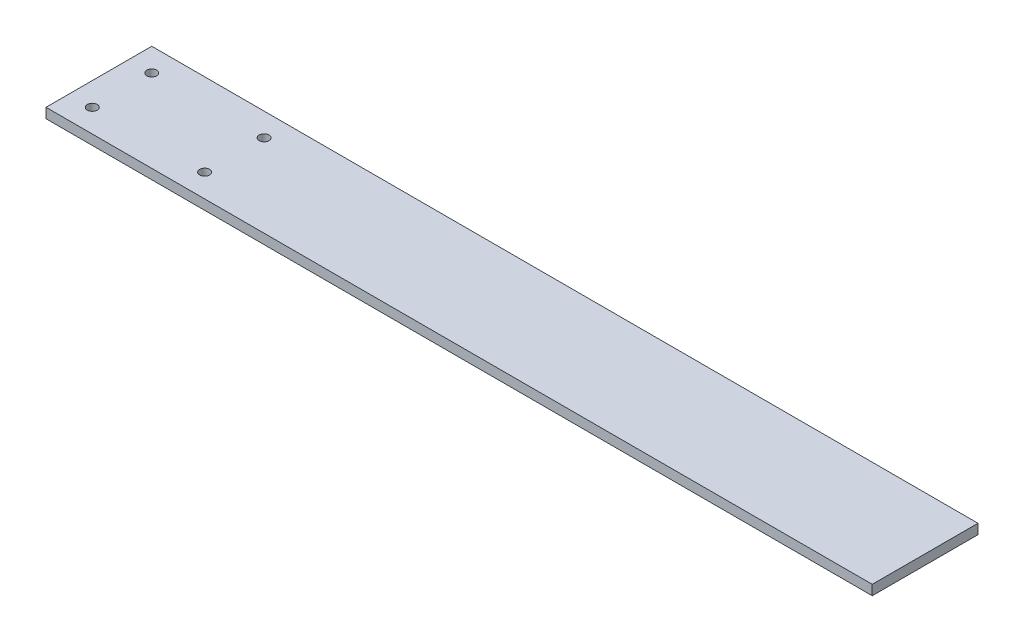
ISO-10303-21;
HEADER;
FILE_DESCRIPTION(('STEP AP214'),'2;1');
FILE_NAME('part.step','',(''),(''),'','','');
FILE_SCHEMA(('AUTOMOTIVE_DESIGN { 1 0 10303 214 1 1 1 1 }'));
ENDSEC;
DATA;
#1=APPLICATION_CONTEXT('core data for automotive mechanical design processes');
#2=APPLICATION_PROTOCOL_DEFINITION('international standard','automotive_design',2000,#1);
#3=PRODUCT_CONTEXT('',#1,'mechanical');
#4=PRODUCT('Part','Part','',(#3));
#5=PRODUCT_RELATED_PRODUCT_CATEGORY('part','',(#4));
#6=PRODUCT_DEFINITION_FORMATION('','',#4);
#7=PRODUCT_DEFINITION_CONTEXT('part definition',#1,'design');
#8=PRODUCT_DEFINITION('design','',#6,#7);
#9=PRODUCT_DEFINITION_SHAPE('','',#8);
#10=(LENGTH_UNIT() NAMED_UNIT(*) SI_UNIT(.MILLI.,.METRE.));
#11=(NAMED_UNIT(*) PLANE_ANGLE_UNIT() SI_UNIT($,.RADIAN.));
#12=(NAMED_UNIT(*) SI_UNIT($,.STERADIAN.) SOLID_ANGLE_UNIT());
#13=UNCERTAINTY_MEASURE_WITH_UNIT(LENGTH_MEASURE(1.E-05),#10,'distance_accuracy_value','');
#14=(GEOMETRIC_REPRESENTATION_CONTEXT(3) GLOBAL_UNCERTAINTY_ASSIGNED_CONTEXT((#13)) GLOBAL_UNIT_ASSIGNED_CONTEXT((#10,
#11,#12)) REPRESENTATION_CONTEXT('',''));
#15=CARTESIAN_POINT('',(0.,0.,0.));
#16=DIRECTION('',(0.,0.,1.));
#17=DIRECTION('',(1.,0.,0.));
#18=AXIS2_PLACEMENT_3D('',#15,#16,#17);
#19=CARTESIAN_POINT('',(0.,3.,0.));
#20=DIRECTION('',(0.,1.,0.));
#21=DIRECTION('',(0.,0.,1.));
#22=AXIS2_PLACEMENT_3D('',#19,#20,#21);
#23=PLANE('',#22);
#24=CARTESIAN_POINT('',(-84.,3.,9.));
#25=DIRECTION('',(0.,1.,0.));
#26=DIRECTION('',(0.,0.,1.));
#27=AXIS2_PLACEMENT_3D('',#24,#25,#26);
#28=CIRCLE('',#27,1.5);
#29=CARTESIAN_POINT('',(-84.,3.,10.5));
#30=VERTEX_POINT('',#29);
#31=EDGE_CURVE('E121',#30,#30,#28,.T.);
#32=ORIENTED_EDGE('',*,*,#31,.F.);
#33=EDGE_LOOP('',(#32));
#34=FACE_BOUND('',#33,.T.);
#35=CARTESIAN_POINT('',(-118.,3.,-9.));
#36=DIRECTION('',(0.,1.,0.));
#37=DIRECTION('',(0.,0.,1.));
#38=AXIS2_PLACEMENT_3D('',#35,#36,#37);
#39=CIRCLE('',#38,1.5);
#40=CARTESIAN_POINT('',(-118.,3.,-7.5));
#41=VERTEX_POINT('',#40);
#42=EDGE_CURVE('E100',#41,#41,#39,.T.);
#43=ORIENTED_EDGE('',*,*,#42,.F.);
#44=EDGE_LOOP('',(#43));
#45=FACE_BOUND('',#44,.T.);
#46=DIRECTION('',(0.,0.,-1.));
#47=VECTOR('',#46,1.);
#48=CARTESIAN_POINT('',(125.,3.,-16.));
#49=LINE('',#48,#47);
#50=CARTESIAN_POINT('',(125.,3.,16.));
#51=VERTEX_POINT('',#50);
#52=CARTESIAN_POINT('',(125.,3.,-16.));
#53=VERTEX_POINT('',#52);
#54=EDGE_CURVE('E85',#51,#53,#49,.T.);
#55=ORIENTED_EDGE('',*,*,#54,.T.);
#56=DIRECTION('',(-1.,0.,0.));
#57=VECTOR('',#56,1.);
#58=CARTESIAN_POINT('',(-125.,3.,-16.));
#59=LINE('',#58,#57);
#60=CARTESIAN_POINT('',(-125.,3.,-16.));
#61=VERTEX_POINT('',#60);
#62=EDGE_CURVE('E80',#53,#61,#59,.T.);
#63=ORIENTED_EDGE('',*,*,#62,.T.);
#64=DIRECTION('',(0.,0.,1.));
#65=VECTOR('',#64,1.);
#66=CARTESIAN_POINT('',(-125.,3.,-16.));
#67=LINE('',#66,#65);
#68=CARTESIAN_POINT('',(-125.,3.,16.));
#69=VERTEX_POINT('',#68);
#70=EDGE_CURVE('E83',#61,#69,#67,.T.);
#71=ORIENTED_EDGE('',*,*,#70,.T.);
#72=DIRECTION('',(1.,0.,0.));
#73=VECTOR('',#72,1.);
#74=CARTESIAN_POINT('',(-125.,3.,16.));
#75=LINE('',#74,#73);
#76=EDGE_CURVE('E50',#69,#51,#75,.T.);
#77=ORIENTED_EDGE('',*,*,#76,.T.);
#78=EDGE_LOOP('',(#55,#63,#71,#77));
#79=FACE_BOUND('',#78,.T.);
#80=CARTESIAN_POINT('',(-118.,3.,9.));
#81=DIRECTION('',(0.,1.,0.));
#82=DIRECTION('',(0.,0.,1.));
#83=AXIS2_PLACEMENT_3D('',#80,#81,#82);
#84=CIRCLE('',#83,1.5);
#85=CARTESIAN_POINT('',(-118.,3.,10.5));
#86=VERTEX_POINT('',#85);
#87=EDGE_CURVE('E115',#86,#86,#84,.T.);
#88=ORIENTED_EDGE('',*,*,#87,.F.);
#89=EDGE_LOOP('',(#88));
#90=FACE_BOUND('',#89,.T.);
#91=CARTESIAN_POINT('',(-84.,3.,-9.));
#92=DIRECTION('',(0.,1.,0.));
#93=DIRECTION('',(0.,0.,1.));
#94=AXIS2_PLACEMENT_3D('',#91,#92,#93);
#95=CIRCLE('',#94,1.5);
#96=CARTESIAN_POINT('',(-84.,3.,-7.5));
#97=VERTEX_POINT('',#96);
#98=EDGE_CURVE('E127',#97,#97,#95,.T.);
#99=ORIENTED_EDGE('',*,*,#98,.F.);
#100=EDGE_LOOP('',(#99));
#101=FACE_BOUND('',#100,.T.);
#102=ADVANCED_FACE('F33',(#34,#45,#79,#90,#101),#23,.T.);
#103=CARTESIAN_POINT('',(0.,0.,0.));
#104=DIRECTION('',(0.,1.,0.));
#105=DIRECTION('',(0.,0.,1.));
#106=AXIS2_PLACEMENT_3D('',#103,#104,#105);
#107=PLANE('',#106);
#108=DIRECTION('',(0.,0.,-1.));
#109=VECTOR('',#108,1.);
#110=CARTESIAN_POINT('',(125.,0.,-16.));
#111=LINE('',#110,#109);
#112=CARTESIAN_POINT('',(125.,0.,16.));
#113=VERTEX_POINT('',#112);
#114=CARTESIAN_POINT('',(125.,0.,-16.));
#115=VERTEX_POINT('',#114);
#116=EDGE_CURVE('E97',#113,#115,#111,.T.);
#117=ORIENTED_EDGE('',*,*,#116,.F.);
#118=DIRECTION('',(1.,0.,0.));
#119=VECTOR('',#118,1.);
#120=CARTESIAN_POINT('',(-125.,0.,16.));
#121=LINE('',#120,#119);
#122=CARTESIAN_POINT('',(-125.,0.,16.));
#123=VERTEX_POINT('',#122);
#124=EDGE_CURVE('E73',#123,#113,#121,.T.);
#125=ORIENTED_EDGE('',*,*,#124,.F.);
#126=DIRECTION('',(0.,0.,1.));
#127=VECTOR('',#126,1.);
#128=CARTESIAN_POINT('',(-125.,0.,-16.));
#129=LINE('',#128,#127);
#130=CARTESIAN_POINT('',(-125.,0.,-16.));
#131=VERTEX_POINT('',#130);
#132=EDGE_CURVE('E67',#131,#123,#129,.T.);
#133=ORIENTED_EDGE('',*,*,#132,.F.);
#134=DIRECTION('',(-1.,0.,0.));
#135=VECTOR('',#134,1.);
#136=CARTESIAN_POINT('',(-125.,0.,-16.));
#137=LINE('',#136,#135);
#138=EDGE_CURVE('E89',#115,#131,#137,.T.);
#139=ORIENTED_EDGE('',*,*,#138,.F.);
#140=EDGE_LOOP('',(#117,#125,#133,#139));
#141=FACE_BOUND('',#140,.T.);
#142=CARTESIAN_POINT('',(-118.,0.,-9.));
#143=DIRECTION('',(0.,1.,0.));
#144=DIRECTION('',(0.,0.,1.));
#145=AXIS2_PLACEMENT_3D('',#142,#143,#144);
#146=CIRCLE('',#145,1.5);
#147=CARTESIAN_POINT('',(-118.,0.,-7.5));
#148=VERTEX_POINT('',#147);
#149=EDGE_CURVE('E112',#148,#148,#146,.T.);
#150=ORIENTED_EDGE('',*,*,#149,.T.);
#151=EDGE_LOOP('',(#150));
#152=FACE_BOUND('',#151,.T.);
#153=CARTESIAN_POINT('',(-118.,0.,9.));
#154=DIRECTION('',(0.,1.,0.));
#155=DIRECTION('',(0.,0.,1.));
#156=AXIS2_PLACEMENT_3D('',#153,#154,#155);
#157=CIRCLE('',#156,1.5);
#158=CARTESIAN_POINT('',(-118.,0.,10.5));
#159=VERTEX_POINT('',#158);
#160=EDGE_CURVE('E118',#159,#159,#157,.T.);
#161=ORIENTED_EDGE('',*,*,#160,.T.);
#162=EDGE_LOOP('',(#161));
#163=FACE_BOUND('',#162,.T.);
#164=CARTESIAN_POINT('',(-84.,0.,9.));
#165=DIRECTION('',(0.,1.,0.));
#166=DIRECTION('',(0.,0.,1.));
#167=AXIS2_PLACEMENT_3D('',#164,#165,#166);
#168=CIRCLE('',#167,1.5);
#169=CARTESIAN_POINT('',(-84.,0.,10.5));
#170=VERTEX_POINT('',#169);
#171=EDGE_CURVE('E124',#170,#170,#168,.T.);
#172=ORIENTED_EDGE('',*,*,#171,.T.);
#173=EDGE_LOOP('',(#172));
#174=FACE_BOUND('',#173,.T.);
#175=CARTESIAN_POINT('',(-84.,0.,-9.));
#176=DIRECTION('',(0.,1.,0.));
#177=DIRECTION('',(0.,0.,1.));
#178=AXIS2_PLACEMENT_3D('',#175,#176,#177);
#179=CIRCLE('',#178,1.5);
#180=CARTESIAN_POINT('',(-84.,0.,-7.5));
#181=VERTEX_POINT('',#180);
#182=EDGE_CURVE('E130',#181,#181,#179,.T.);
#183=ORIENTED_EDGE('',*,*,#182,.T.);
#184=EDGE_LOOP('',(#183));
#185=FACE_BOUND('',#184,.T.);
#186=ADVANCED_FACE('F108',(#141,#152,#163,#174,#185),#107,.F.);
#187=CARTESIAN_POINT('',(125.,3.,-16.));
#188=DIRECTION('',(-1.,0.,0.));
#189=DIRECTION('',(0.,0.,1.));
#190=AXIS2_PLACEMENT_3D('',#187,#188,#189);
#191=PLANE('',#190);
#192=ORIENTED_EDGE('',*,*,#116,.T.);
#193=DIRECTION('',(0.,-1.,0.));
#194=VECTOR('',#193,1.);
#195=CARTESIAN_POINT('',(125.,3.,-16.));
#196=LINE('',#195,#194);
#197=EDGE_CURVE('E11',#53,#115,#196,.T.);
#198=ORIENTED_EDGE('',*,*,#197,.F.);
#199=ORIENTED_EDGE('',*,*,#54,.F.);
#200=DIRECTION('',(0.,-1.,0.));
#201=VECTOR('',#200,1.);
#202=CARTESIAN_POINT('',(125.,3.,16.));
#203=LINE('',#202,#201);
#204=EDGE_CURVE('E93',#51,#113,#203,.T.);
#205=ORIENTED_EDGE('',*,*,#204,.T.);
#206=EDGE_LOOP('',(#192,#198,#199,#205));
#207=FACE_BOUND('',#206,.T.);
#208=ADVANCED_FACE('F35',(#207),#191,.F.);
#209=CARTESIAN_POINT('',(-125.,3.,-16.));
#210=DIRECTION('',(0.,0.,1.));
#211=DIRECTION('',(1.,0.,0.));
#212=AXIS2_PLACEMENT_3D('',#209,#210,#211);
#213=PLANE('',#212);
#214=ORIENTED_EDGE('',*,*,#138,.T.);
#215=DIRECTION('',(0.,-1.,0.));
#216=VECTOR('',#215,1.);
#217=CARTESIAN_POINT('',(-125.,3.,-16.));
#218=LINE('',#217,#216);
#219=EDGE_CURVE('E42',#61,#131,#218,.T.);
#220=ORIENTED_EDGE('',*,*,#219,.F.);
#221=ORIENTED_EDGE('',*,*,#62,.F.);
#222=ORIENTED_EDGE('',*,*,#197,.T.);
#223=EDGE_LOOP('',(#214,#220,#221,#222));
#224=FACE_BOUND('',#223,.T.);
#225=ADVANCED_FACE('F88',(#224),#213,.F.);
#226=CARTESIAN_POINT('',(-125.,3.,-16.));
#227=DIRECTION('',(1.,0.,0.));
#228=DIRECTION('',(0.,0.,-1.));
#229=AXIS2_PLACEMENT_3D('',#226,#227,#228);
#230=PLANE('',#229);
#231=ORIENTED_EDGE('',*,*,#132,.T.);
#232=DIRECTION('',(0.,-1.,0.));
#233=VECTOR('',#232,1.);
#234=CARTESIAN_POINT('',(-125.,3.,16.));
#235=LINE('',#234,#233);
#236=EDGE_CURVE('E90',#69,#123,#235,.T.);
#237=ORIENTED_EDGE('',*,*,#236,.F.);
#238=ORIENTED_EDGE('',*,*,#70,.F.);
#239=ORIENTED_EDGE('',*,*,#219,.T.);
#240=EDGE_LOOP('',(#231,#237,#238,#239));
#241=FACE_BOUND('',#240,.T.);
#242=ADVANCED_FACE('F91',(#241),#230,.F.);
#243=CARTESIAN_POINT('',(-125.,3.,16.));
#244=DIRECTION('',(0.,0.,-1.));
#245=DIRECTION('',(-1.,0.,0.));
#246=AXIS2_PLACEMENT_3D('',#243,#244,#245);
#247=PLANE('',#246);
#248=ORIENTED_EDGE('',*,*,#124,.T.);
#249=ORIENTED_EDGE('',*,*,#204,.F.);
#250=ORIENTED_EDGE('',*,*,#76,.F.);
#251=ORIENTED_EDGE('',*,*,#236,.T.);
#252=EDGE_LOOP('',(#248,#249,#250,#251));
#253=FACE_BOUND('',#252,.T.);
#254=ADVANCED_FACE('F105',(#253),#247,.F.);
#255=CARTESIAN_POINT('',(-118.,3.,-9.));
#256=DIRECTION('',(0.,-1.,0.));
#257=DIRECTION('',(0.,0.,-1.));
#258=AXIS2_PLACEMENT_3D('',#255,#256,#257);
#259=CYLINDRICAL_SURFACE('',#258,1.5);
#260=ORIENTED_EDGE('',*,*,#42,.T.);
#261=EDGE_LOOP('',(#260));
#262=FACE_BOUND('',#261,.T.);
#263=ORIENTED_EDGE('',*,*,#149,.F.);
#264=EDGE_LOOP('',(#263));
#265=FACE_BOUND('',#264,.T.);
#266=ADVANCED_FACE('F149',(#262,#265),#259,.F.);
#267=CARTESIAN_POINT('',(-118.,3.,9.));
#268=DIRECTION('',(0.,-1.,0.));
#269=DIRECTION('',(0.,0.,-1.));
#270=AXIS2_PLACEMENT_3D('',#267,#268,#269);
#271=CYLINDRICAL_SURFACE('',#270,1.5);
#272=ORIENTED_EDGE('',*,*,#87,.T.);
#273=EDGE_LOOP('',(#272));
#274=FACE_BOUND('',#273,.T.);
#275=ORIENTED_EDGE('',*,*,#160,.F.);
#276=EDGE_LOOP('',(#275));
#277=FACE_BOUND('',#276,.T.);
#278=ADVANCED_FACE('F195',(#274,#277),#271,.F.);
#279=CARTESIAN_POINT('',(-84.,3.,9.));
#280=DIRECTION('',(0.,-1.,0.));
#281=DIRECTION('',(0.,0.,-1.));
#282=AXIS2_PLACEMENT_3D('',#279,#280,#281);
#283=CYLINDRICAL_SURFACE('',#282,1.5);
#284=ORIENTED_EDGE('',*,*,#31,.T.);
#285=EDGE_LOOP('',(#284));
#286=FACE_BOUND('',#285,.T.);
#287=ORIENTED_EDGE('',*,*,#171,.F.);
#288=EDGE_LOOP('',(#287));
#289=FACE_BOUND('',#288,.T.);
#290=ADVANCED_FACE('F203',(#286,#289),#283,.F.);
#291=CARTESIAN_POINT('',(-84.,3.,-9.));
#292=DIRECTION('',(0.,-1.,0.));
#293=DIRECTION('',(0.,0.,-1.));
#294=AXIS2_PLACEMENT_3D('',#291,#292,#293);
#295=CYLINDRICAL_SURFACE('',#294,1.5);
#296=ORIENTED_EDGE('',*,*,#98,.T.);
#297=EDGE_LOOP('',(#296));
#298=FACE_BOUND('',#297,.T.);
#299=ORIENTED_EDGE('',*,*,#182,.F.);
#300=EDGE_LOOP('',(#299));
#301=FACE_BOUND('',#300,.T.);
#302=ADVANCED_FACE('F136',(#298,#301),#295,.F.);
#303=CLOSED_SHELL('',(#102,#186,#208,#225,#242,#254,#266,#278,#290,#302));
#304=MANIFOLD_SOLID_BREP('B2',#303);
#305=ADVANCED_BREP_SHAPE_REPRESENTATION('',(#18,#304),#14);
#306=SHAPE_DEFINITION_REPRESENTATION(#9,#305);
ENDSEC;
END-ISO-10303-21;
